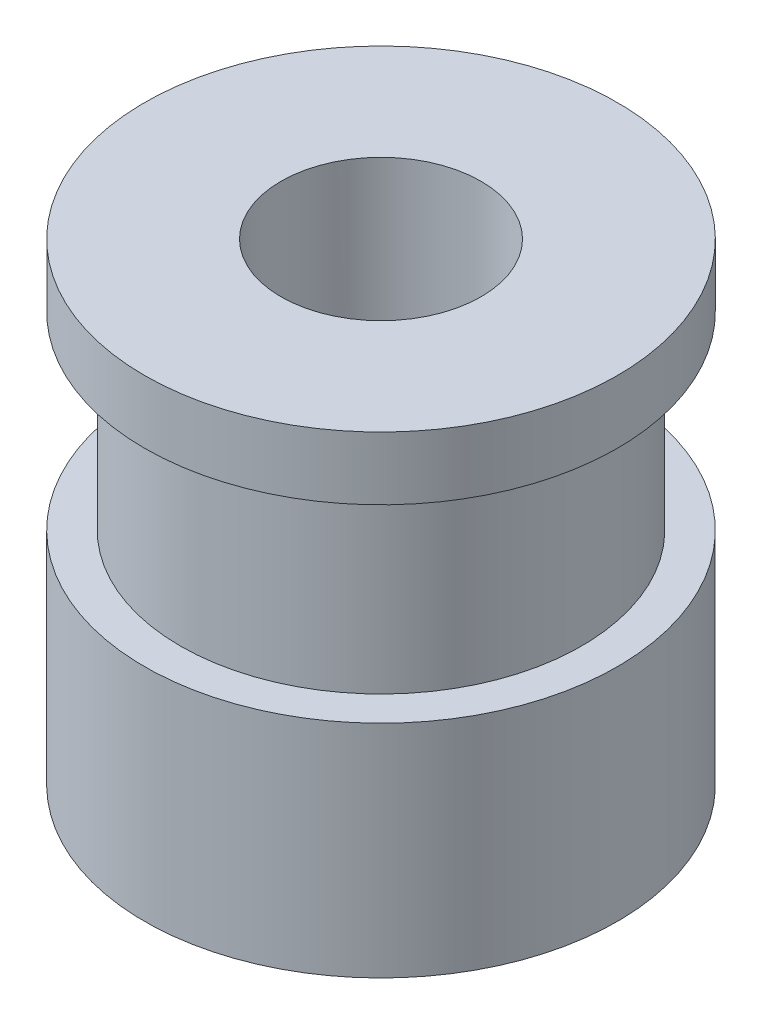
ISO-10303-21;
HEADER;
FILE_DESCRIPTION(('STEP AP214'),'2;1');
FILE_NAME('part.step','',(''),(''),'','','');
FILE_SCHEMA(('AUTOMOTIVE_DESIGN { 1 0 10303 214 1 1 1 1 }'));
ENDSEC;
DATA;
#1=APPLICATION_CONTEXT('core data for automotive mechanical design processes');
#2=APPLICATION_PROTOCOL_DEFINITION('international standard','automotive_design',2000,#1);
#3=PRODUCT_CONTEXT('',#1,'mechanical');
#4=PRODUCT('Part','Part','',(#3));
#5=PRODUCT_RELATED_PRODUCT_CATEGORY('part','',(#4));
#6=PRODUCT_DEFINITION_FORMATION('','',#4);
#7=PRODUCT_DEFINITION_CONTEXT('part definition',#1,'design');
#8=PRODUCT_DEFINITION('design','',#6,#7);
#9=PRODUCT_DEFINITION_SHAPE('','',#8);
#10=(LENGTH_UNIT() NAMED_UNIT(*) SI_UNIT(.MILLI.,.METRE.));
#11=(NAMED_UNIT(*) PLANE_ANGLE_UNIT() SI_UNIT($,.RADIAN.));
#12=(NAMED_UNIT(*) SI_UNIT($,.STERADIAN.) SOLID_ANGLE_UNIT());
#13=UNCERTAINTY_MEASURE_WITH_UNIT(LENGTH_MEASURE(1.E-05),#10,'distance_accuracy_value','');
#14=(GEOMETRIC_REPRESENTATION_CONTEXT(3) GLOBAL_UNCERTAINTY_ASSIGNED_CONTEXT((#13)) GLOBAL_UNIT_ASSIGNED_CONTEXT((#10,
#11,#12)) REPRESENTATION_CONTEXT('',''));
#15=CARTESIAN_POINT('',(0.,0.,0.));
#16=DIRECTION('',(0.,0.,1.));
#17=DIRECTION('',(1.,0.,0.));
#18=AXIS2_PLACEMENT_3D('',#15,#16,#17);
#19=CARTESIAN_POINT('',(0.,10.,0.));
#20=DIRECTION('',(0.,-1.,0.));
#21=DIRECTION('',(0.,0.,-1.));
#22=AXIS2_PLACEMENT_3D('',#19,#20,#21);
#23=CYLINDRICAL_SURFACE('',#22,6.366);
#24=CARTESIAN_POINT('',(0.,8.,0.));
#25=DIRECTION('',(0.,1.,0.));
#26=DIRECTION('',(0.,0.,1.));
#27=AXIS2_PLACEMENT_3D('',#24,#25,#26);
#28=CIRCLE('',#27,6.366);
#29=CARTESIAN_POINT('',(0.,8.,6.366));
#30=VERTEX_POINT('',#29);
#31=EDGE_CURVE('E38',#30,#30,#28,.T.);
#32=ORIENTED_EDGE('',*,*,#31,.F.);
#33=EDGE_LOOP('',(#32));
#34=FACE_BOUND('',#33,.T.);
#35=CARTESIAN_POINT('',(0.,2.,0.));
#36=DIRECTION('',(0.,-1.,0.));
#37=DIRECTION('',(0.,0.,-1.));
#38=AXIS2_PLACEMENT_3D('',#35,#36,#37);
#39=CIRCLE('',#38,6.366);
#40=CARTESIAN_POINT('',(0.,2.,-6.366));
#41=VERTEX_POINT('',#40);
#42=EDGE_CURVE('E10',#41,#41,#39,.T.);
#43=ORIENTED_EDGE('',*,*,#42,.F.);
#44=EDGE_LOOP('',(#43));
#45=FACE_BOUND('',#44,.T.);
#46=ADVANCED_FACE('F31',(#34,#45),#23,.T.);
#47=CARTESIAN_POINT('',(0.,10.,0.));
#48=DIRECTION('',(0.,1.,0.));
#49=DIRECTION('',(0.,0.,1.));
#50=AXIS2_PLACEMENT_3D('',#47,#48,#49);
#51=PLANE('',#50);
#52=CARTESIAN_POINT('',(0.,10.,0.));
#53=DIRECTION('',(0.,1.,0.));
#54=DIRECTION('',(0.,0.,1.));
#55=AXIS2_PLACEMENT_3D('',#52,#53,#54);
#56=CIRCLE('',#55,3.175);
#57=CARTESIAN_POINT('',(0.,10.,3.175));
#58=VERTEX_POINT('',#57);
#59=EDGE_CURVE('E34',#58,#58,#56,.T.);
#60=ORIENTED_EDGE('',*,*,#59,.F.);
#61=EDGE_LOOP('',(#60));
#62=FACE_BOUND('',#61,.T.);
#63=CARTESIAN_POINT('',(0.,10.,0.));
#64=DIRECTION('',(0.,1.,0.));
#65=DIRECTION('',(0.,0.,1.));
#66=AXIS2_PLACEMENT_3D('',#63,#64,#65);
#67=CIRCLE('',#66,7.5);
#68=CARTESIAN_POINT('',(0.,10.,7.5));
#69=VERTEX_POINT('',#68);
#70=EDGE_CURVE('E50',#69,#69,#67,.T.);
#71=ORIENTED_EDGE('',*,*,#70,.T.);
#72=EDGE_LOOP('',(#71));
#73=FACE_BOUND('',#72,.T.);
#74=ADVANCED_FACE('F82',(#62,#73),#51,.T.);
#75=CARTESIAN_POINT('',(0.,10.,0.));
#76=DIRECTION('',(0.,-1.,0.));
#77=DIRECTION('',(0.,0.,-1.));
#78=AXIS2_PLACEMENT_3D('',#75,#76,#77);
#79=CYLINDRICAL_SURFACE('',#78,3.175);
#80=ORIENTED_EDGE('',*,*,#59,.T.);
#81=EDGE_LOOP('',(#80));
#82=FACE_BOUND('',#81,.T.);
#83=CARTESIAN_POINT('',(0.,-5.,0.));
#84=DIRECTION('',(0.,-1.,0.));
#85=DIRECTION('',(0.,0.,-1.));
#86=AXIS2_PLACEMENT_3D('',#83,#84,#85);
#87=CIRCLE('',#86,3.175);
#88=CARTESIAN_POINT('',(0.,-5.,-3.175));
#89=VERTEX_POINT('',#88);
#90=EDGE_CURVE('E55',#89,#89,#87,.T.);
#91=ORIENTED_EDGE('',*,*,#90,.T.);
#92=EDGE_LOOP('',(#91));
#93=FACE_BOUND('',#92,.T.);
#94=ADVANCED_FACE('F87',(#82,#93),#79,.F.);
#95=CARTESIAN_POINT('',(0.,8.,0.));
#96=DIRECTION('',(0.,1.,0.));
#97=DIRECTION('',(0.,0.,1.));
#98=AXIS2_PLACEMENT_3D('',#95,#96,#97);
#99=PLANE('',#98);
#100=CARTESIAN_POINT('',(0.,8.,0.));
#101=DIRECTION('',(0.,1.,0.));
#102=DIRECTION('',(0.,0.,1.));
#103=AXIS2_PLACEMENT_3D('',#100,#101,#102);
#104=CIRCLE('',#103,7.5);
#105=CARTESIAN_POINT('',(0.,8.,7.5));
#106=VERTEX_POINT('',#105);
#107=EDGE_CURVE('E47',#106,#106,#104,.T.);
#108=ORIENTED_EDGE('',*,*,#107,.F.);
#109=EDGE_LOOP('',(#108));
#110=FACE_BOUND('',#109,.T.);
#111=ORIENTED_EDGE('',*,*,#31,.T.);
#112=EDGE_LOOP('',(#111));
#113=FACE_BOUND('',#112,.T.);
#114=ADVANCED_FACE('F78',(#110,#113),#99,.F.);
#115=CARTESIAN_POINT('',(0.,8.,0.));
#116=DIRECTION('',(0.,1.,0.));
#117=DIRECTION('',(0.,0.,1.));
#118=AXIS2_PLACEMENT_3D('',#115,#116,#117);
#119=CYLINDRICAL_SURFACE('',#118,7.5);
#120=ORIENTED_EDGE('',*,*,#107,.T.);
#121=EDGE_LOOP('',(#120));
#122=FACE_BOUND('',#121,.T.);
#123=ORIENTED_EDGE('',*,*,#70,.F.);
#124=EDGE_LOOP('',(#123));
#125=FACE_BOUND('',#124,.T.);
#126=ADVANCED_FACE('F71',(#122,#125),#119,.T.);
#127=CARTESIAN_POINT('',(0.,2.,0.));
#128=DIRECTION('',(0.,-1.,0.));
#129=DIRECTION('',(0.,0.,-1.));
#130=AXIS2_PLACEMENT_3D('',#127,#128,#129);
#131=PLANE('',#130);
#132=CARTESIAN_POINT('',(0.,2.,0.));
#133=DIRECTION('',(0.,-1.,0.));
#134=DIRECTION('',(0.,0.,-1.));
#135=AXIS2_PLACEMENT_3D('',#132,#133,#134);
#136=CIRCLE('',#135,7.5);
#137=CARTESIAN_POINT('',(0.,2.,-7.5));
#138=VERTEX_POINT('',#137);
#139=EDGE_CURVE('E59',#138,#138,#136,.T.);
#140=ORIENTED_EDGE('',*,*,#139,.F.);
#141=EDGE_LOOP('',(#140));
#142=FACE_BOUND('',#141,.T.);
#143=ORIENTED_EDGE('',*,*,#42,.T.);
#144=EDGE_LOOP('',(#143));
#145=FACE_BOUND('',#144,.T.);
#146=ADVANCED_FACE('F68',(#142,#145),#131,.F.);
#147=CARTESIAN_POINT('',(0.,-5.,0.));
#148=DIRECTION('',(0.,-1.,0.));
#149=DIRECTION('',(0.,0.,-1.));
#150=AXIS2_PLACEMENT_3D('',#147,#148,#149);
#151=PLANE('',#150);
#152=CARTESIAN_POINT('',(0.,-5.,0.));
#153=DIRECTION('',(0.,-1.,0.));
#154=DIRECTION('',(0.,0.,-1.));
#155=AXIS2_PLACEMENT_3D('',#152,#153,#154);
#156=CIRCLE('',#155,7.5);
#157=CARTESIAN_POINT('',(0.,-5.,-7.5));
#158=VERTEX_POINT('',#157);
#159=EDGE_CURVE('E45',#158,#158,#156,.T.);
#160=ORIENTED_EDGE('',*,*,#159,.T.);
#161=EDGE_LOOP('',(#160));
#162=FACE_BOUND('',#161,.T.);
#163=ORIENTED_EDGE('',*,*,#90,.F.);
#164=EDGE_LOOP('',(#163));
#165=FACE_BOUND('',#164,.T.);
#166=ADVANCED_FACE('F70',(#162,#165),#151,.T.);
#167=CARTESIAN_POINT('',(0.,-5.,0.));
#168=DIRECTION('',(0.,1.,0.));
#169=DIRECTION('',(0.,0.,1.));
#170=AXIS2_PLACEMENT_3D('',#167,#168,#169);
#171=CYLINDRICAL_SURFACE('',#170,7.5);
#172=ORIENTED_EDGE('',*,*,#159,.F.);
#173=EDGE_LOOP('',(#172));
#174=FACE_BOUND('',#173,.T.);
#175=ORIENTED_EDGE('',*,*,#139,.T.);
#176=EDGE_LOOP('',(#175));
#177=FACE_BOUND('',#176,.T.);
#178=ADVANCED_FACE('F66',(#174,#177),#171,.T.);
#179=CLOSED_SHELL('',(#46,#74,#94,#114,#126,#146,#166,#178));
#180=MANIFOLD_SOLID_BREP('B2',#179);
#181=ADVANCED_BREP_SHAPE_REPRESENTATION('',(#18,#180),#14);
#182=SHAPE_DEFINITION_REPRESENTATION(#9,#181);
ENDSEC;
END-ISO-10303-21;
